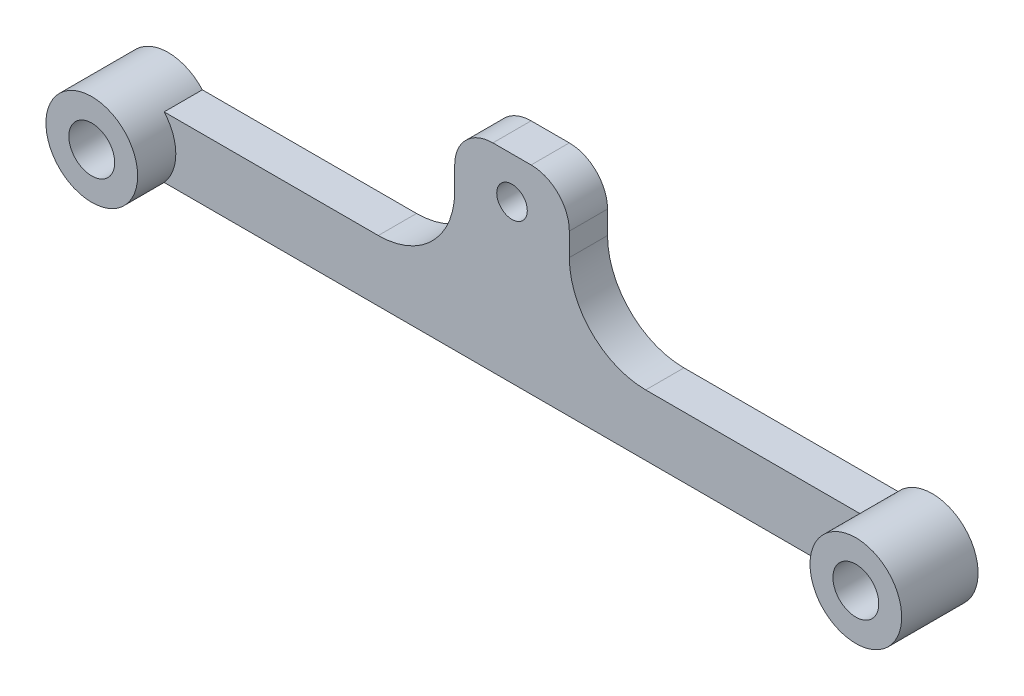
ISO-10303-21;
HEADER;
FILE_DESCRIPTION(('STEP AP214'),'2;1');
FILE_NAME('part.step','',(''),(''),'','','');
FILE_SCHEMA(('AUTOMOTIVE_DESIGN { 1 0 10303 214 1 1 1 1 }'));
ENDSEC;
DATA;
#1=APPLICATION_CONTEXT('core data for automotive mechanical design processes');
#2=APPLICATION_PROTOCOL_DEFINITION('international standard','automotive_design',2000,#1);
#3=PRODUCT_CONTEXT('',#1,'mechanical');
#4=PRODUCT('Part','Part','',(#3));
#5=PRODUCT_RELATED_PRODUCT_CATEGORY('part','',(#4));
#6=PRODUCT_DEFINITION_FORMATION('','',#4);
#7=PRODUCT_DEFINITION_CONTEXT('part definition',#1,'design');
#8=PRODUCT_DEFINITION('design','',#6,#7);
#9=PRODUCT_DEFINITION_SHAPE('','',#8);
#10=(LENGTH_UNIT() NAMED_UNIT(*) SI_UNIT(.MILLI.,.METRE.));
#11=(NAMED_UNIT(*) PLANE_ANGLE_UNIT() SI_UNIT($,.RADIAN.));
#12=(NAMED_UNIT(*) SI_UNIT($,.STERADIAN.) SOLID_ANGLE_UNIT());
#13=UNCERTAINTY_MEASURE_WITH_UNIT(LENGTH_MEASURE(1.E-05),#10,'distance_accuracy_value','');
#14=(GEOMETRIC_REPRESENTATION_CONTEXT(3) GLOBAL_UNCERTAINTY_ASSIGNED_CONTEXT((#13)) GLOBAL_UNIT_ASSIGNED_CONTEXT((#10,
#11,#12)) REPRESENTATION_CONTEXT('',''));
#15=CARTESIAN_POINT('',(0.,0.,0.));
#16=DIRECTION('',(0.,0.,1.));
#17=DIRECTION('',(1.,0.,0.));
#18=AXIS2_PLACEMENT_3D('',#15,#16,#17);
#19=CARTESIAN_POINT('',(50.,4.,0.));
#20=DIRECTION('',(0.,-1.,0.));
#21=DIRECTION('',(0.,0.,-1.));
#22=AXIS2_PLACEMENT_3D('',#19,#20,#21);
#23=PLANE('',#22);
#24=DIRECTION('',(-1.,0.,0.));
#25=VECTOR('',#24,1.);
#26=CARTESIAN_POINT('',(50.,4.,0.));
#27=LINE('',#26,#25);
#28=CARTESIAN_POINT('',(95.5278640450004,4.,0.));
#29=VERTEX_POINT('',#28);
#30=CARTESIAN_POINT('',(67.5,4.,0.));
#31=VERTEX_POINT('',#30);
#32=EDGE_CURVE('E141',#29,#31,#27,.T.);
#33=ORIENTED_EDGE('',*,*,#32,.T.);
#34=DIRECTION('',(0.,0.,-1.));
#35=VECTOR('',#34,1.);
#36=CARTESIAN_POINT('',(67.5,4.,0.));
#37=LINE('',#36,#35);
#38=CARTESIAN_POINT('',(67.5,4.,5.));
#39=VERTEX_POINT('',#38);
#40=EDGE_CURVE('E209',#31,#39,#37,.F.);
#41=ORIENTED_EDGE('',*,*,#40,.T.);
#42=DIRECTION('',(-1.,0.,0.));
#43=VECTOR('',#42,1.);
#44=CARTESIAN_POINT('',(50.,4.,5.));
#45=LINE('',#44,#43);
#46=CARTESIAN_POINT('',(95.5278640450004,4.,5.));
#47=VERTEX_POINT('',#46);
#48=EDGE_CURVE('E168',#47,#39,#45,.T.);
#49=ORIENTED_EDGE('',*,*,#48,.F.);
#50=DIRECTION('',(0.,0.,-1.));
#51=VECTOR('',#50,1.);
#52=CARTESIAN_POINT('',(95.5278640450004,4.,10.));
#53=LINE('',#52,#51);
#54=EDGE_CURVE('E146',#29,#47,#53,.F.);
#55=ORIENTED_EDGE('',*,*,#54,.F.);
#56=EDGE_LOOP('',(#33,#41,#49,#55));
#57=FACE_BOUND('',#56,.T.);
#58=ADVANCED_FACE('F34',(#57),#23,.F.);
#59=CARTESIAN_POINT('',(0.,0.,10.));
#60=DIRECTION('',(0.,0.,-1.));
#61=DIRECTION('',(-1.,0.,0.));
#62=AXIS2_PLACEMENT_3D('',#59,#60,#61);
#63=CYLINDRICAL_SURFACE('',#62,6.);
#64=CARTESIAN_POINT('',(0.,0.,10.));
#65=DIRECTION('',(0.,0.,1.));
#66=DIRECTION('',(1.,0.,0.));
#67=AXIS2_PLACEMENT_3D('',#64,#65,#66);
#68=CIRCLE('',#67,6.);
#69=CARTESIAN_POINT('',(6.,0.,10.));
#70=VERTEX_POINT('',#69);
#71=EDGE_CURVE('E178',#70,#70,#68,.T.);
#72=ORIENTED_EDGE('',*,*,#71,.F.);
#73=EDGE_LOOP('',(#72));
#74=FACE_BOUND('',#73,.T.);
#75=DIRECTION('',(0.,0.,-1.));
#76=VECTOR('',#75,1.);
#77=CARTESIAN_POINT('',(4.47213595499958,4.,10.));
#78=LINE('',#77,#76);
#79=CARTESIAN_POINT('',(4.47213595499958,4.,0.));
#80=VERTEX_POINT('',#79);
#81=CARTESIAN_POINT('',(4.47213595499958,4.,5.));
#82=VERTEX_POINT('',#81);
#83=EDGE_CURVE('E174',#80,#82,#78,.F.);
#84=ORIENTED_EDGE('',*,*,#83,.F.);
#85=CARTESIAN_POINT('',(0.,0.,0.));
#86=DIRECTION('',(0.,0.,1.));
#87=DIRECTION('',(1.,0.,0.));
#88=AXIS2_PLACEMENT_3D('',#85,#86,#87);
#89=CIRCLE('',#88,6.);
#90=CARTESIAN_POINT('',(4.47213595499958,-4.,0.));
#91=VERTEX_POINT('',#90);
#92=EDGE_CURVE('E177',#80,#91,#89,.T.);
#93=ORIENTED_EDGE('',*,*,#92,.T.);
#94=DIRECTION('',(0.,0.,-1.));
#95=VECTOR('',#94,1.);
#96=CARTESIAN_POINT('',(4.47213595499958,-4.,10.));
#97=LINE('',#96,#95);
#98=CARTESIAN_POINT('',(4.47213595499958,-4.,5.));
#99=VERTEX_POINT('',#98);
#100=EDGE_CURVE('E130',#99,#91,#97,.T.);
#101=ORIENTED_EDGE('',*,*,#100,.F.);
#102=CARTESIAN_POINT('',(0.,0.,5.));
#103=DIRECTION('',(0.,0.,-1.));
#104=DIRECTION('',(0.,1.,0.));
#105=AXIS2_PLACEMENT_3D('',#102,#103,#104);
#106=CIRCLE('',#105,6.);
#107=EDGE_CURVE('E181',#82,#99,#106,.T.);
#108=ORIENTED_EDGE('',*,*,#107,.F.);
#109=EDGE_LOOP('',(#84,#93,#101,#108));
#110=FACE_BOUND('',#109,.T.);
#111=ADVANCED_FACE('F242',(#74,#110),#63,.T.);
#112=CARTESIAN_POINT('',(0.,0.,10.));
#113=DIRECTION('',(0.,0.,1.));
#114=DIRECTION('',(1.,0.,0.));
#115=AXIS2_PLACEMENT_3D('',#112,#113,#114);
#116=PLANE('',#115);
#117=CARTESIAN_POINT('',(0.,0.,10.));
#118=DIRECTION('',(0.,0.,1.));
#119=DIRECTION('',(1.,0.,0.));
#120=AXIS2_PLACEMENT_3D('',#117,#118,#119);
#121=CIRCLE('',#120,3.);
#122=CARTESIAN_POINT('',(3.,0.,10.));
#123=VERTEX_POINT('',#122);
#124=EDGE_CURVE('E162',#123,#123,#121,.T.);
#125=ORIENTED_EDGE('',*,*,#124,.F.);
#126=EDGE_LOOP('',(#125));
#127=FACE_BOUND('',#126,.T.);
#128=ORIENTED_EDGE('',*,*,#71,.T.);
#129=EDGE_LOOP('',(#128));
#130=FACE_BOUND('',#129,.T.);
#131=ADVANCED_FACE('F270',(#127,#130),#116,.T.);
#132=CARTESIAN_POINT('',(0.,0.,0.));
#133=DIRECTION('',(0.,0.,1.));
#134=DIRECTION('',(1.,0.,0.));
#135=AXIS2_PLACEMENT_3D('',#132,#133,#134);
#136=PLANE('',#135);
#137=CARTESIAN_POINT('',(50.,16.57,0.));
#138=DIRECTION('',(0.,0.,-1.));
#139=DIRECTION('',(-1.,0.,0.));
#140=AXIS2_PLACEMENT_3D('',#137,#138,#139);
#141=CIRCLE('',#140,2.);
#142=CARTESIAN_POINT('',(48.,16.57,0.));
#143=VERTEX_POINT('',#142);
#144=EDGE_CURVE('E262',#143,#143,#141,.T.);
#145=ORIENTED_EDGE('',*,*,#144,.F.);
#146=EDGE_LOOP('',(#145));
#147=FACE_BOUND('',#146,.T.);
#148=CARTESIAN_POINT('',(0.,0.,0.));
#149=DIRECTION('',(0.,0.,1.));
#150=DIRECTION('',(1.,0.,0.));
#151=AXIS2_PLACEMENT_3D('',#148,#149,#150);
#152=CIRCLE('',#151,3.);
#153=CARTESIAN_POINT('',(3.,0.,0.));
#154=VERTEX_POINT('',#153);
#155=EDGE_CURVE('E133',#154,#154,#152,.T.);
#156=ORIENTED_EDGE('',*,*,#155,.T.);
#157=EDGE_LOOP('',(#156));
#158=FACE_BOUND('',#157,.T.);
#159=DIRECTION('',(1.,0.,0.));
#160=VECTOR('',#159,1.);
#161=CARTESIAN_POINT('',(57.5,22.,0.));
#162=LINE('',#161,#160);
#163=CARTESIAN_POINT('',(47.5,22.,0.));
#164=VERTEX_POINT('',#163);
#165=CARTESIAN_POINT('',(52.5,22.,0.));
#166=VERTEX_POINT('',#165);
#167=EDGE_CURVE('E254',#164,#166,#162,.T.);
#168=ORIENTED_EDGE('',*,*,#167,.T.);
#169=CARTESIAN_POINT('',(52.5,17.,0.));
#170=DIRECTION('',(0.,0.,1.));
#171=DIRECTION('',(1.,0.,0.));
#172=AXIS2_PLACEMENT_3D('',#169,#170,#171);
#173=CIRCLE('',#172,5.);
#174=CARTESIAN_POINT('',(57.5,17.,0.));
#175=VERTEX_POINT('',#174);
#176=EDGE_CURVE('E194',#166,#175,#173,.F.);
#177=ORIENTED_EDGE('',*,*,#176,.T.);
#178=DIRECTION('',(0.,-1.,0.));
#179=VECTOR('',#178,1.);
#180=CARTESIAN_POINT('',(57.5,4.,0.));
#181=LINE('',#180,#179);
#182=CARTESIAN_POINT('',(57.5,14.,0.));
#183=VERTEX_POINT('',#182);
#184=EDGE_CURVE('E236',#175,#183,#181,.T.);
#185=ORIENTED_EDGE('',*,*,#184,.T.);
#186=CARTESIAN_POINT('',(67.5,14.,0.));
#187=DIRECTION('',(0.,0.,1.));
#188=DIRECTION('',(1.,0.,0.));
#189=AXIS2_PLACEMENT_3D('',#186,#187,#188);
#190=CIRCLE('',#189,10.);
#191=EDGE_CURVE('E215',#183,#31,#190,.T.);
#192=ORIENTED_EDGE('',*,*,#191,.T.);
#193=ORIENTED_EDGE('',*,*,#32,.F.);
#194=CARTESIAN_POINT('',(100.,0.,0.));
#195=DIRECTION('',(0.,0.,-1.));
#196=DIRECTION('',(-1.,0.,0.));
#197=AXIS2_PLACEMENT_3D('',#194,#195,#196);
#198=CIRCLE('',#197,6.);
#199=CARTESIAN_POINT('',(95.5278640450004,-4.,0.));
#200=VERTEX_POINT('',#199);
#201=EDGE_CURVE('E136',#29,#200,#198,.T.);
#202=ORIENTED_EDGE('',*,*,#201,.T.);
#203=DIRECTION('',(-1.,0.,0.));
#204=VECTOR('',#203,1.);
#205=CARTESIAN_POINT('',(50.,-4.,0.));
#206=LINE('',#205,#204);
#207=EDGE_CURVE('E123',#200,#91,#206,.T.);
#208=ORIENTED_EDGE('',*,*,#207,.T.);
#209=ORIENTED_EDGE('',*,*,#92,.F.);
#210=CARTESIAN_POINT('',(32.5,4.,0.));
#211=VERTEX_POINT('',#210);
#212=EDGE_CURVE('E171',#211,#80,#27,.T.);
#213=ORIENTED_EDGE('',*,*,#212,.F.);
#214=CARTESIAN_POINT('',(32.5,14.,0.));
#215=DIRECTION('',(0.,0.,1.));
#216=DIRECTION('',(1.,0.,0.));
#217=AXIS2_PLACEMENT_3D('',#214,#215,#216);
#218=CIRCLE('',#217,10.);
#219=CARTESIAN_POINT('',(42.5,14.,0.));
#220=VERTEX_POINT('',#219);
#221=EDGE_CURVE('E42',#211,#220,#218,.T.);
#222=ORIENTED_EDGE('',*,*,#221,.T.);
#223=DIRECTION('',(0.,1.,0.));
#224=VECTOR('',#223,1.);
#225=CARTESIAN_POINT('',(42.5,22.,0.));
#226=LINE('',#225,#224);
#227=CARTESIAN_POINT('',(42.5,17.,0.));
#228=VERTEX_POINT('',#227);
#229=EDGE_CURVE('E256',#220,#228,#226,.T.);
#230=ORIENTED_EDGE('',*,*,#229,.T.);
#231=CARTESIAN_POINT('',(47.5,17.,0.));
#232=DIRECTION('',(0.,0.,1.));
#233=DIRECTION('',(1.,0.,0.));
#234=AXIS2_PLACEMENT_3D('',#231,#232,#233);
#235=CIRCLE('',#234,5.);
#236=EDGE_CURVE('E192',#228,#164,#235,.F.);
#237=ORIENTED_EDGE('',*,*,#236,.T.);
#238=EDGE_LOOP('',(#168,#177,#185,#192,#193,#202,#208,#209,#213,#222,#230,#237));
#239=FACE_BOUND('',#238,.T.);
#240=CARTESIAN_POINT('',(100.,0.,0.));
#241=DIRECTION('',(0.,0.,-1.));
#242=DIRECTION('',(-1.,0.,0.));
#243=AXIS2_PLACEMENT_3D('',#240,#241,#242);
#244=CIRCLE('',#243,3.);
#245=CARTESIAN_POINT('',(97.,0.,0.));
#246=VERTEX_POINT('',#245);
#247=EDGE_CURVE('E151',#246,#246,#244,.T.);
#248=ORIENTED_EDGE('',*,*,#247,.F.);
#249=EDGE_LOOP('',(#248));
#250=FACE_BOUND('',#249,.T.);
#251=ADVANCED_FACE('F138',(#147,#158,#239,#250),#136,.F.);
#252=CARTESIAN_POINT('',(32.5,4.,5.));
#253=VERTEX_POINT('',#252);
#254=EDGE_CURVE('E167',#253,#82,#45,.T.);
#255=ORIENTED_EDGE('',*,*,#254,.F.);
#256=DIRECTION('',(0.,0.,-1.));
#257=VECTOR('',#256,1.);
#258=CARTESIAN_POINT('',(32.5,4.,0.));
#259=LINE('',#258,#257);
#260=EDGE_CURVE('E211',#253,#211,#259,.T.);
#261=ORIENTED_EDGE('',*,*,#260,.T.);
#262=ORIENTED_EDGE('',*,*,#212,.T.);
#263=ORIENTED_EDGE('',*,*,#83,.T.);
#264=EDGE_LOOP('',(#255,#261,#262,#263));
#265=FACE_BOUND('',#264,.T.);
#266=ADVANCED_FACE('F244',(#265),#23,.F.);
#267=CARTESIAN_POINT('',(50.,-4.,0.));
#268=DIRECTION('',(0.,1.,0.));
#269=DIRECTION('',(0.,0.,1.));
#270=AXIS2_PLACEMENT_3D('',#267,#268,#269);
#271=PLANE('',#270);
#272=DIRECTION('',(-1.,0.,0.));
#273=VECTOR('',#272,1.);
#274=CARTESIAN_POINT('',(50.,-4.,5.));
#275=LINE('',#274,#273);
#276=CARTESIAN_POINT('',(95.5278640450004,-4.,5.));
#277=VERTEX_POINT('',#276);
#278=EDGE_CURVE('E132',#277,#99,#275,.T.);
#279=ORIENTED_EDGE('',*,*,#278,.T.);
#280=ORIENTED_EDGE('',*,*,#100,.T.);
#281=ORIENTED_EDGE('',*,*,#207,.F.);
#282=DIRECTION('',(0.,0.,-1.));
#283=VECTOR('',#282,1.);
#284=CARTESIAN_POINT('',(95.5278640450004,-4.,10.));
#285=LINE('',#284,#283);
#286=EDGE_CURVE('E128',#277,#200,#285,.T.);
#287=ORIENTED_EDGE('',*,*,#286,.F.);
#288=EDGE_LOOP('',(#279,#280,#281,#287));
#289=FACE_BOUND('',#288,.T.);
#290=ADVANCED_FACE('F126',(#289),#271,.F.);
#291=CARTESIAN_POINT('',(50.,4.,5.));
#292=DIRECTION('',(0.,0.,-1.));
#293=DIRECTION('',(0.,1.,0.));
#294=AXIS2_PLACEMENT_3D('',#291,#292,#293);
#295=PLANE('',#294);
#296=CARTESIAN_POINT('',(50.,16.57,5.));
#297=DIRECTION('',(0.,0.,-1.));
#298=DIRECTION('',(0.,1.,0.));
#299=AXIS2_PLACEMENT_3D('',#296,#297,#298);
#300=CIRCLE('',#299,2.);
#301=CARTESIAN_POINT('',(50.,18.57,5.));
#302=VERTEX_POINT('',#301);
#303=EDGE_CURVE('E257',#302,#302,#300,.F.);
#304=ORIENTED_EDGE('',*,*,#303,.F.);
#305=EDGE_LOOP('',(#304));
#306=FACE_BOUND('',#305,.T.);
#307=ORIENTED_EDGE('',*,*,#48,.T.);
#308=CARTESIAN_POINT('',(67.5,14.,5.));
#309=DIRECTION('',(0.,0.,-1.));
#310=DIRECTION('',(0.,1.,0.));
#311=AXIS2_PLACEMENT_3D('',#308,#309,#310);
#312=CIRCLE('',#311,10.);
#313=CARTESIAN_POINT('',(57.5,14.,5.));
#314=VERTEX_POINT('',#313);
#315=EDGE_CURVE('E217',#39,#314,#312,.T.);
#316=ORIENTED_EDGE('',*,*,#315,.T.);
#317=DIRECTION('',(0.,1.,0.));
#318=VECTOR('',#317,1.);
#319=CARTESIAN_POINT('',(57.5,4.00000000000001,5.));
#320=LINE('',#319,#318);
#321=CARTESIAN_POINT('',(57.5,17.,5.));
#322=VERTEX_POINT('',#321);
#323=EDGE_CURVE('E222',#314,#322,#320,.T.);
#324=ORIENTED_EDGE('',*,*,#323,.T.);
#325=CARTESIAN_POINT('',(52.5,17.,5.));
#326=DIRECTION('',(0.,0.,-1.));
#327=DIRECTION('',(0.,1.,0.));
#328=AXIS2_PLACEMENT_3D('',#325,#326,#327);
#329=CIRCLE('',#328,5.);
#330=CARTESIAN_POINT('',(52.5,22.,5.));
#331=VERTEX_POINT('',#330);
#332=EDGE_CURVE('E201',#322,#331,#329,.F.);
#333=ORIENTED_EDGE('',*,*,#332,.T.);
#334=DIRECTION('',(-1.,0.,0.));
#335=VECTOR('',#334,1.);
#336=CARTESIAN_POINT('',(57.5,22.,5.));
#337=LINE('',#336,#335);
#338=CARTESIAN_POINT('',(47.5,22.,5.));
#339=VERTEX_POINT('',#338);
#340=EDGE_CURVE('E233',#331,#339,#337,.T.);
#341=ORIENTED_EDGE('',*,*,#340,.T.);
#342=CARTESIAN_POINT('',(47.5,17.,5.));
#343=DIRECTION('',(0.,0.,-1.));
#344=DIRECTION('',(0.,1.,0.));
#345=AXIS2_PLACEMENT_3D('',#342,#343,#344);
#346=CIRCLE('',#345,5.);
#347=CARTESIAN_POINT('',(42.5,17.,5.));
#348=VERTEX_POINT('',#347);
#349=EDGE_CURVE('E199',#339,#348,#346,.F.);
#350=ORIENTED_EDGE('',*,*,#349,.T.);
#351=DIRECTION('',(0.,-1.,0.));
#352=VECTOR('',#351,1.);
#353=CARTESIAN_POINT('',(42.5,22.,5.));
#354=LINE('',#353,#352);
#355=CARTESIAN_POINT('',(42.5,14.,5.));
#356=VERTEX_POINT('',#355);
#357=EDGE_CURVE('E232',#348,#356,#354,.T.);
#358=ORIENTED_EDGE('',*,*,#357,.T.);
#359=CARTESIAN_POINT('',(32.5,14.,5.));
#360=DIRECTION('',(0.,0.,-1.));
#361=DIRECTION('',(0.,1.,0.));
#362=AXIS2_PLACEMENT_3D('',#359,#360,#361);
#363=CIRCLE('',#362,10.);
#364=EDGE_CURVE('E11',#356,#253,#363,.T.);
#365=ORIENTED_EDGE('',*,*,#364,.T.);
#366=ORIENTED_EDGE('',*,*,#254,.T.);
#367=ORIENTED_EDGE('',*,*,#107,.T.);
#368=ORIENTED_EDGE('',*,*,#278,.F.);
#369=CARTESIAN_POINT('',(100.,0.,5.));
#370=DIRECTION('',(0.,0.,1.));
#371=DIRECTION('',(0.,1.,0.));
#372=AXIS2_PLACEMENT_3D('',#369,#370,#371);
#373=CIRCLE('',#372,6.);
#374=EDGE_CURVE('E150',#47,#277,#373,.T.);
#375=ORIENTED_EDGE('',*,*,#374,.F.);
#376=EDGE_LOOP('',(#307,#316,#324,#333,#341,#350,#358,#365,#366,#367,#368,#375));
#377=FACE_BOUND('',#376,.T.);
#378=ADVANCED_FACE('F221',(#306,#377),#295,.F.);
#379=CARTESIAN_POINT('',(0.,0.,-20.));
#380=DIRECTION('',(0.,0.,1.));
#381=DIRECTION('',(1.,0.,0.));
#382=AXIS2_PLACEMENT_3D('',#379,#380,#381);
#383=CYLINDRICAL_SURFACE('',#382,3.);
#384=ORIENTED_EDGE('',*,*,#124,.T.);
#385=EDGE_LOOP('',(#384));
#386=FACE_BOUND('',#385,.T.);
#387=ORIENTED_EDGE('',*,*,#155,.F.);
#388=EDGE_LOOP('',(#387));
#389=FACE_BOUND('',#388,.T.);
#390=ADVANCED_FACE('F274',(#386,#389),#383,.F.);
#391=CARTESIAN_POINT('',(100.,0.,10.));
#392=DIRECTION('',(0.,0.,-1.));
#393=DIRECTION('',(1.,0.,0.));
#394=AXIS2_PLACEMENT_3D('',#391,#392,#393);
#395=CYLINDRICAL_SURFACE('',#394,6.);
#396=CARTESIAN_POINT('',(100.,0.,10.));
#397=DIRECTION('',(0.,0.,-1.));
#398=DIRECTION('',(-1.,0.,0.));
#399=AXIS2_PLACEMENT_3D('',#396,#397,#398);
#400=CIRCLE('',#399,6.);
#401=CARTESIAN_POINT('',(94.,0.,10.));
#402=VERTEX_POINT('',#401);
#403=EDGE_CURVE('E145',#402,#402,#400,.T.);
#404=ORIENTED_EDGE('',*,*,#403,.T.);
#405=EDGE_LOOP('',(#404));
#406=FACE_BOUND('',#405,.T.);
#407=ORIENTED_EDGE('',*,*,#54,.T.);
#408=ORIENTED_EDGE('',*,*,#374,.T.);
#409=ORIENTED_EDGE('',*,*,#286,.T.);
#410=ORIENTED_EDGE('',*,*,#201,.F.);
#411=EDGE_LOOP('',(#407,#408,#409,#410));
#412=FACE_BOUND('',#411,.T.);
#413=ADVANCED_FACE('F148',(#406,#412),#395,.T.);
#414=CARTESIAN_POINT('',(100.,0.,10.));
#415=DIRECTION('',(0.,0.,1.));
#416=DIRECTION('',(-1.,0.,0.));
#417=AXIS2_PLACEMENT_3D('',#414,#415,#416);
#418=PLANE('',#417);
#419=CARTESIAN_POINT('',(100.,0.,10.));
#420=DIRECTION('',(0.,0.,-1.));
#421=DIRECTION('',(-1.,0.,0.));
#422=AXIS2_PLACEMENT_3D('',#419,#420,#421);
#423=CIRCLE('',#422,3.);
#424=CARTESIAN_POINT('',(97.,0.,10.));
#425=VERTEX_POINT('',#424);
#426=EDGE_CURVE('E155',#425,#425,#423,.T.);
#427=ORIENTED_EDGE('',*,*,#426,.T.);
#428=EDGE_LOOP('',(#427));
#429=FACE_BOUND('',#428,.T.);
#430=ORIENTED_EDGE('',*,*,#403,.F.);
#431=EDGE_LOOP('',(#430));
#432=FACE_BOUND('',#431,.T.);
#433=ADVANCED_FACE('F282',(#429,#432),#418,.T.);
#434=CARTESIAN_POINT('',(100.,0.,-20.));
#435=DIRECTION('',(0.,0.,1.));
#436=DIRECTION('',(-1.,0.,0.));
#437=AXIS2_PLACEMENT_3D('',#434,#435,#436);
#438=CYLINDRICAL_SURFACE('',#437,3.);
#439=ORIENTED_EDGE('',*,*,#426,.F.);
#440=EDGE_LOOP('',(#439));
#441=FACE_BOUND('',#440,.T.);
#442=ORIENTED_EDGE('',*,*,#247,.T.);
#443=EDGE_LOOP('',(#442));
#444=FACE_BOUND('',#443,.T.);
#445=ADVANCED_FACE('F372',(#441,#444),#438,.F.);
#446=CARTESIAN_POINT('',(57.5,4.,28.43074902772));
#447=DIRECTION('',(1.,0.,0.));
#448=DIRECTION('',(0.,0.,-1.));
#449=AXIS2_PLACEMENT_3D('',#446,#447,#448);
#450=PLANE('',#449);
#451=ORIENTED_EDGE('',*,*,#323,.F.);
#452=DIRECTION('',(0.,0.,-1.));
#453=VECTOR('',#452,1.);
#454=CARTESIAN_POINT('',(57.5,14.,28.43074902772));
#455=LINE('',#454,#453);
#456=EDGE_CURVE('E206',#314,#183,#455,.T.);
#457=ORIENTED_EDGE('',*,*,#456,.T.);
#458=ORIENTED_EDGE('',*,*,#184,.F.);
#459=DIRECTION('',(0.,0.,-1.));
#460=VECTOR('',#459,1.);
#461=CARTESIAN_POINT('',(57.5,17.,28.43074902772));
#462=LINE('',#461,#460);
#463=EDGE_CURVE('E196',#175,#322,#462,.F.);
#464=ORIENTED_EDGE('',*,*,#463,.T.);
#465=EDGE_LOOP('',(#451,#457,#458,#464));
#466=FACE_BOUND('',#465,.T.);
#467=ADVANCED_FACE('F227',(#466),#450,.T.);
#468=CARTESIAN_POINT('',(57.5,22.,28.43074902772));
#469=DIRECTION('',(0.,1.,0.));
#470=DIRECTION('',(0.,0.,1.));
#471=AXIS2_PLACEMENT_3D('',#468,#469,#470);
#472=PLANE('',#471);
#473=ORIENTED_EDGE('',*,*,#340,.F.);
#474=DIRECTION('',(0.,0.,-1.));
#475=VECTOR('',#474,1.);
#476=CARTESIAN_POINT('',(52.5,22.,28.43074902772));
#477=LINE('',#476,#475);
#478=EDGE_CURVE('E189',#331,#166,#477,.T.);
#479=ORIENTED_EDGE('',*,*,#478,.T.);
#480=ORIENTED_EDGE('',*,*,#167,.F.);
#481=DIRECTION('',(0.,0.,-1.));
#482=VECTOR('',#481,1.);
#483=CARTESIAN_POINT('',(47.5,22.,28.43074902772));
#484=LINE('',#483,#482);
#485=EDGE_CURVE('E185',#164,#339,#484,.F.);
#486=ORIENTED_EDGE('',*,*,#485,.T.);
#487=EDGE_LOOP('',(#473,#479,#480,#486));
#488=FACE_BOUND('',#487,.T.);
#489=ADVANCED_FACE('F358',(#488),#472,.T.);
#490=CARTESIAN_POINT('',(42.5,22.,28.43074902772));
#491=DIRECTION('',(-1.,0.,0.));
#492=DIRECTION('',(0.,0.,1.));
#493=AXIS2_PLACEMENT_3D('',#490,#491,#492);
#494=PLANE('',#493);
#495=ORIENTED_EDGE('',*,*,#229,.F.);
#496=DIRECTION('',(0.,0.,-1.));
#497=VECTOR('',#496,1.);
#498=CARTESIAN_POINT('',(42.5,14.,28.43074902772));
#499=LINE('',#498,#497);
#500=EDGE_CURVE('E55',#220,#356,#499,.F.);
#501=ORIENTED_EDGE('',*,*,#500,.T.);
#502=ORIENTED_EDGE('',*,*,#357,.F.);
#503=DIRECTION('',(0.,0.,-1.));
#504=VECTOR('',#503,1.);
#505=CARTESIAN_POINT('',(42.5,17.,28.43074902772));
#506=LINE('',#505,#504);
#507=EDGE_CURVE('E203',#348,#228,#506,.T.);
#508=ORIENTED_EDGE('',*,*,#507,.T.);
#509=EDGE_LOOP('',(#495,#501,#502,#508));
#510=FACE_BOUND('',#509,.T.);
#511=ADVANCED_FACE('F350',(#510),#494,.T.);
#512=CARTESIAN_POINT('',(52.5,17.,28.43074902772));
#513=DIRECTION('',(0.,0.,-1.));
#514=DIRECTION('',(-1.,0.,0.));
#515=AXIS2_PLACEMENT_3D('',#512,#513,#514);
#516=CYLINDRICAL_SURFACE('',#515,5.);
#517=ORIENTED_EDGE('',*,*,#332,.F.);
#518=ORIENTED_EDGE('',*,*,#463,.F.);
#519=ORIENTED_EDGE('',*,*,#176,.F.);
#520=ORIENTED_EDGE('',*,*,#478,.F.);
#521=EDGE_LOOP('',(#517,#518,#519,#520));
#522=FACE_BOUND('',#521,.T.);
#523=ADVANCED_FACE('F342',(#522),#516,.T.);
#524=CARTESIAN_POINT('',(47.5,17.,28.43074902772));
#525=DIRECTION('',(0.,0.,-1.));
#526=DIRECTION('',(-1.,0.,0.));
#527=AXIS2_PLACEMENT_3D('',#524,#525,#526);
#528=CYLINDRICAL_SURFACE('',#527,5.);
#529=ORIENTED_EDGE('',*,*,#349,.F.);
#530=ORIENTED_EDGE('',*,*,#485,.F.);
#531=ORIENTED_EDGE('',*,*,#236,.F.);
#532=ORIENTED_EDGE('',*,*,#507,.F.);
#533=EDGE_LOOP('',(#529,#530,#531,#532));
#534=FACE_BOUND('',#533,.T.);
#535=ADVANCED_FACE('F335',(#534),#528,.T.);
#536=CARTESIAN_POINT('',(67.5,14.,28.43074902772));
#537=DIRECTION('',(0.,0.,-1.));
#538=DIRECTION('',(0.,1.,0.));
#539=AXIS2_PLACEMENT_3D('',#536,#537,#538);
#540=CYLINDRICAL_SURFACE('',#539,10.);
#541=ORIENTED_EDGE('',*,*,#315,.F.);
#542=ORIENTED_EDGE('',*,*,#40,.F.);
#543=ORIENTED_EDGE('',*,*,#191,.F.);
#544=ORIENTED_EDGE('',*,*,#456,.F.);
#545=EDGE_LOOP('',(#541,#542,#543,#544));
#546=FACE_BOUND('',#545,.T.);
#547=ADVANCED_FACE('F235',(#546),#540,.F.);
#548=CARTESIAN_POINT('',(32.5,14.,0.));
#549=DIRECTION('',(0.,0.,-1.));
#550=DIRECTION('',(0.,1.,0.));
#551=AXIS2_PLACEMENT_3D('',#548,#549,#550);
#552=CYLINDRICAL_SURFACE('',#551,10.);
#553=ORIENTED_EDGE('',*,*,#364,.F.);
#554=ORIENTED_EDGE('',*,*,#500,.F.);
#555=ORIENTED_EDGE('',*,*,#221,.F.);
#556=ORIENTED_EDGE('',*,*,#260,.F.);
#557=EDGE_LOOP('',(#553,#554,#555,#556));
#558=FACE_BOUND('',#557,.T.);
#559=ADVANCED_FACE('F36',(#558),#552,.F.);
#560=CARTESIAN_POINT('',(50.,16.57,10.6568542494924));
#561=DIRECTION('',(0.,0.,-1.));
#562=DIRECTION('',(-1.,0.,0.));
#563=AXIS2_PLACEMENT_3D('',#560,#561,#562);
#564=CYLINDRICAL_SURFACE('',#563,2.);
#565=ORIENTED_EDGE('',*,*,#303,.T.);
#566=EDGE_LOOP('',(#565));
#567=FACE_BOUND('',#566,.T.);
#568=ORIENTED_EDGE('',*,*,#144,.T.);
#569=EDGE_LOOP('',(#568));
#570=FACE_BOUND('',#569,.T.);
#571=ADVANCED_FACE('F266',(#567,#570),#564,.F.);
#572=CLOSED_SHELL('',(#58,#111,#131,#251,#266,#290,#378,#390,#413,#433,#445,#467,#489,#511,#523,
#535,#547,#559,#571));
#573=MANIFOLD_SOLID_BREP('B2',#572);
#574=ADVANCED_BREP_SHAPE_REPRESENTATION('',(#18,#573),#14);
#575=SHAPE_DEFINITION_REPRESENTATION(#9,#574);
ENDSEC;
END-ISO-10303-21;
